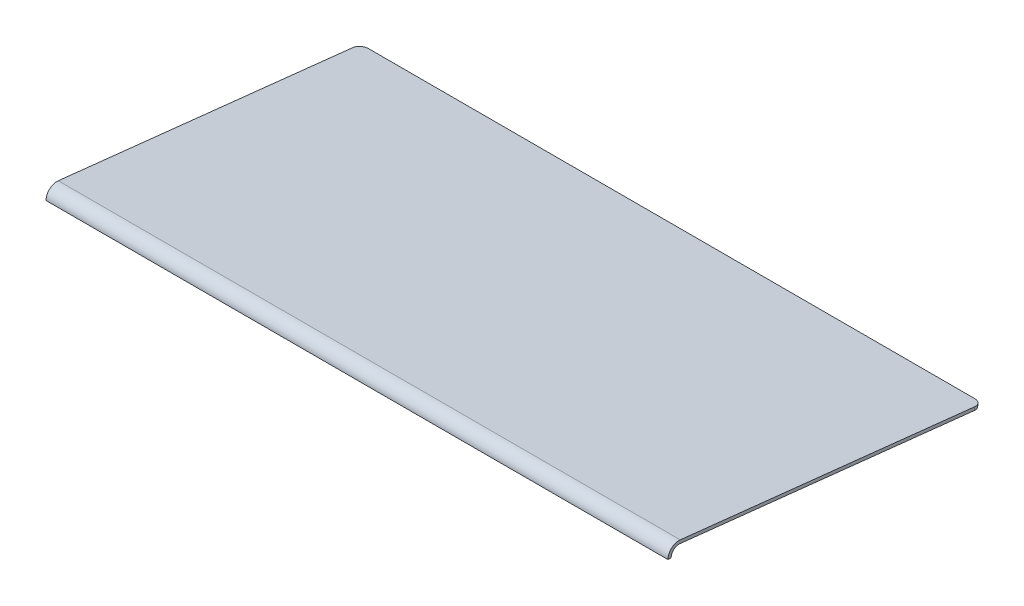
ISO-10303-21;
HEADER;
FILE_DESCRIPTION(('STEP AP214'),'2;1');
FILE_NAME('part.step','',(''),(''),'','','');
FILE_SCHEMA(('AUTOMOTIVE_DESIGN { 1 0 10303 214 1 1 1 1 }'));
ENDSEC;
DATA;
#1=APPLICATION_CONTEXT('core data for automotive mechanical design processes');
#2=APPLICATION_PROTOCOL_DEFINITION('international standard','automotive_design',2000,#1);
#3=PRODUCT_CONTEXT('',#1,'mechanical');
#4=PRODUCT('Part','Part','',(#3));
#5=PRODUCT_RELATED_PRODUCT_CATEGORY('part','',(#4));
#6=PRODUCT_DEFINITION_FORMATION('','',#4);
#7=PRODUCT_DEFINITION_CONTEXT('part definition',#1,'design');
#8=PRODUCT_DEFINITION('design','',#6,#7);
#9=PRODUCT_DEFINITION_SHAPE('','',#8);
#10=(LENGTH_UNIT() NAMED_UNIT(*) SI_UNIT(.MILLI.,.METRE.));
#11=(NAMED_UNIT(*) PLANE_ANGLE_UNIT() SI_UNIT($,.RADIAN.));
#12=(NAMED_UNIT(*) SI_UNIT($,.STERADIAN.) SOLID_ANGLE_UNIT());
#13=UNCERTAINTY_MEASURE_WITH_UNIT(LENGTH_MEASURE(1.E-05),#10,'distance_accuracy_value','');
#14=(GEOMETRIC_REPRESENTATION_CONTEXT(3) GLOBAL_UNCERTAINTY_ASSIGNED_CONTEXT((#13)) GLOBAL_UNIT_ASSIGNED_CONTEXT((#10,
#11,#12)) REPRESENTATION_CONTEXT('',''));
#15=CARTESIAN_POINT('',(0.,0.,0.));
#16=DIRECTION('',(0.,0.,1.));
#17=DIRECTION('',(1.,0.,0.));
#18=AXIS2_PLACEMENT_3D('',#15,#16,#17);
#19=CARTESIAN_POINT('',(362.,0.,0.));
#20=DIRECTION('',(1.,0.,0.));
#21=DIRECTION('',(0.,0.,-1.));
#22=AXIS2_PLACEMENT_3D('',#19,#20,#21);
#23=PLANE('',#22);
#24=DIRECTION('',(0.,0.,-1.));
#25=VECTOR('',#24,1.);
#26=CARTESIAN_POINT('',(362.,113.937005826671,37.4));
#27=LINE('',#26,#25);
#28=CARTESIAN_POINT('',(362.,113.937005826671,39.4));
#29=VERTEX_POINT('',#28);
#30=CARTESIAN_POINT('',(362.,113.937005826671,37.4));
#31=VERTEX_POINT('',#30);
#32=EDGE_CURVE('E56',#29,#31,#27,.T.);
#33=ORIENTED_EDGE('',*,*,#32,.T.);
#34=CARTESIAN_POINT('',(362.,113.937005826671,32.4));
#35=DIRECTION('',(1.,0.,0.));
#36=DIRECTION('',(0.,0.,-1.));
#37=AXIS2_PLACEMENT_3D('',#34,#35,#36);
#38=CIRCLE('',#37,5.00000000000001);
#39=CARTESIAN_POINT('',(362.,118.907830843486,31.8606497870554));
#40=VERTEX_POINT('',#39);
#41=EDGE_CURVE('E165',#40,#31,#38,.T.);
#42=ORIENTED_EDGE('',*,*,#41,.F.);
#43=DIRECTION('',(0.,0.107870042588919,0.994165003363056));
#44=VECTOR('',#43,1.);
#45=CARTESIAN_POINT('',(362.,100.,-142.4));
#46=LINE('',#45,#44);
#47=CARTESIAN_POINT('',(362.,98.6622549779722,-154.729088340045));
#48=VERTEX_POINT('',#47);
#49=EDGE_CURVE('E159',#48,#40,#46,.T.);
#50=ORIENTED_EDGE('',*,*,#49,.F.);
#51=DIRECTION('',(0.,-0.994165003363056,0.107870042588914));
#52=VECTOR('',#51,1.);
#53=CARTESIAN_POINT('',(362.,-15.4452148796673,-142.348067491777));
#54=LINE('',#53,#52);
#55=CARTESIAN_POINT('',(362.,100.650584984698,-154.944828425223));
#56=VERTEX_POINT('',#55);
#57=EDGE_CURVE('E151',#48,#56,#54,.F.);
#58=ORIENTED_EDGE('',*,*,#57,.T.);
#59=DIRECTION('',(0.,-0.107870042588919,-0.994165003363056));
#60=VECTOR('',#59,1.);
#61=CARTESIAN_POINT('',(362.,101.988330006726,-142.615740085178));
#62=LINE('',#61,#60);
#63=CARTESIAN_POINT('',(362.,120.896160850212,31.6449097018776));
#64=VERTEX_POINT('',#63);
#65=EDGE_CURVE('E120',#64,#56,#62,.T.);
#66=ORIENTED_EDGE('',*,*,#65,.F.);
#67=CARTESIAN_POINT('',(362.,113.937005826671,32.4));
#68=DIRECTION('',(1.,0.,0.));
#69=DIRECTION('',(0.,0.,-1.));
#70=AXIS2_PLACEMENT_3D('',#67,#68,#69);
#71=CIRCLE('',#70,7.00000000000001);
#72=EDGE_CURVE('E164',#29,#64,#71,.F.);
#73=ORIENTED_EDGE('',*,*,#72,.F.);
#74=EDGE_LOOP('',(#33,#42,#50,#58,#66,#73));
#75=FACE_BOUND('',#74,.T.);
#76=ADVANCED_FACE('F39',(#75),#23,.T.);
#77=CARTESIAN_POINT('',(-32.,113.937005826671,32.4));
#78=DIRECTION('',(-1.,0.,0.));
#79=DIRECTION('',(0.,0.,1.));
#80=AXIS2_PLACEMENT_3D('',#77,#78,#79);
#81=PLANE('',#80);
#82=DIRECTION('',(0.,0.,-1.));
#83=VECTOR('',#82,1.);
#84=CARTESIAN_POINT('',(-32.,113.937005826671,37.4));
#85=LINE('',#84,#83);
#86=CARTESIAN_POINT('',(-32.,113.937005826671,39.4));
#87=VERTEX_POINT('',#86);
#88=CARTESIAN_POINT('',(-32.,113.937005826671,37.4));
#89=VERTEX_POINT('',#88);
#90=EDGE_CURVE('E12',#87,#89,#85,.T.);
#91=ORIENTED_EDGE('',*,*,#90,.F.);
#92=CARTESIAN_POINT('',(-32.,113.937005826671,32.4));
#93=DIRECTION('',(-1.,0.,0.));
#94=DIRECTION('',(0.,0.,1.));
#95=AXIS2_PLACEMENT_3D('',#92,#93,#94);
#96=CIRCLE('',#95,7.00000000000001);
#97=CARTESIAN_POINT('',(-32.,120.896160850212,31.6449097018776));
#98=VERTEX_POINT('',#97);
#99=EDGE_CURVE('E154',#87,#98,#96,.T.);
#100=ORIENTED_EDGE('',*,*,#99,.T.);
#101=DIRECTION('',(0.,-0.107870042588919,-0.994165003363056));
#102=VECTOR('',#101,1.);
#103=CARTESIAN_POINT('',(-32.,101.988330006726,-142.615740085178));
#104=LINE('',#103,#102);
#105=CARTESIAN_POINT('',(-32.,100.650584984698,-154.944828425223));
#106=VERTEX_POINT('',#105);
#107=EDGE_CURVE('E150',#98,#106,#104,.T.);
#108=ORIENTED_EDGE('',*,*,#107,.T.);
#109=DIRECTION('',(0.,-0.994165003363056,0.107870042588914));
#110=VECTOR('',#109,1.);
#111=CARTESIAN_POINT('',(-32.,93.6914299611579,-154.1897381271));
#112=LINE('',#111,#110);
#113=CARTESIAN_POINT('',(-32.,98.6622549779722,-154.729088340045));
#114=VERTEX_POINT('',#113);
#115=EDGE_CURVE('E146',#106,#114,#112,.T.);
#116=ORIENTED_EDGE('',*,*,#115,.T.);
#117=DIRECTION('',(0.,0.107870042588919,0.994165003363056));
#118=VECTOR('',#117,1.);
#119=CARTESIAN_POINT('',(-32.,100.,-142.4));
#120=LINE('',#119,#118);
#121=CARTESIAN_POINT('',(-32.,118.907830843486,31.8606497870554));
#122=VERTEX_POINT('',#121);
#123=EDGE_CURVE('E149',#114,#122,#120,.T.);
#124=ORIENTED_EDGE('',*,*,#123,.T.);
#125=CARTESIAN_POINT('',(-32.,113.937005826671,32.4));
#126=DIRECTION('',(1.,0.,0.));
#127=DIRECTION('',(0.,0.,1.));
#128=AXIS2_PLACEMENT_3D('',#125,#126,#127);
#129=CIRCLE('',#128,5.00000000000001);
#130=EDGE_CURVE('E181',#122,#89,#129,.T.);
#131=ORIENTED_EDGE('',*,*,#130,.T.);
#132=EDGE_LOOP('',(#91,#100,#108,#116,#124,#131));
#133=FACE_BOUND('',#132,.T.);
#134=ADVANCED_FACE('F207',(#133),#81,.T.);
#135=CARTESIAN_POINT('',(853.368633251326,113.937005826671,32.4));
#136=DIRECTION('',(-1.,0.,0.));
#137=DIRECTION('',(0.,0.,1.));
#138=AXIS2_PLACEMENT_3D('',#135,#136,#137);
#139=CYLINDRICAL_SURFACE('',#138,5.00000000000001);
#140=DIRECTION('',(-1.,0.,0.));
#141=VECTOR('',#140,1.);
#142=CARTESIAN_POINT('',(853.368633251326,118.907830843486,31.8606497870554));
#143=LINE('',#142,#141);
#144=EDGE_CURVE('E155',#40,#122,#143,.T.);
#145=ORIENTED_EDGE('',*,*,#144,.F.);
#146=ORIENTED_EDGE('',*,*,#41,.T.);
#147=DIRECTION('',(-1.,0.,0.));
#148=VECTOR('',#147,1.);
#149=CARTESIAN_POINT('',(853.368633251326,113.937005826671,37.4));
#150=LINE('',#149,#148);
#151=EDGE_CURVE('E160',#31,#89,#150,.T.);
#152=ORIENTED_EDGE('',*,*,#151,.T.);
#153=ORIENTED_EDGE('',*,*,#130,.F.);
#154=EDGE_LOOP('',(#145,#146,#152,#153));
#155=FACE_BOUND('',#154,.T.);
#156=ADVANCED_FACE('F198',(#155),#139,.F.);
#157=CARTESIAN_POINT('',(853.368633251326,113.937005826671,32.4));
#158=DIRECTION('',(-1.,0.,0.));
#159=DIRECTION('',(0.,0.,1.));
#160=AXIS2_PLACEMENT_3D('',#157,#158,#159);
#161=CYLINDRICAL_SURFACE('',#160,7.00000000000001);
#162=DIRECTION('',(-1.,0.,0.));
#163=VECTOR('',#162,1.);
#164=CARTESIAN_POINT('',(853.368633251326,113.937005826671,39.4));
#165=LINE('',#164,#163);
#166=EDGE_CURVE('E48',#29,#87,#165,.T.);
#167=ORIENTED_EDGE('',*,*,#166,.F.);
#168=ORIENTED_EDGE('',*,*,#72,.T.);
#169=DIRECTION('',(-1.,0.,0.));
#170=VECTOR('',#169,1.);
#171=CARTESIAN_POINT('',(853.368633251326,120.896160850212,31.6449097018776));
#172=LINE('',#171,#170);
#173=EDGE_CURVE('E168',#64,#98,#172,.T.);
#174=ORIENTED_EDGE('',*,*,#173,.T.);
#175=ORIENTED_EDGE('',*,*,#99,.F.);
#176=EDGE_LOOP('',(#167,#168,#174,#175));
#177=FACE_BOUND('',#176,.T.);
#178=ADVANCED_FACE('F205',(#177),#161,.T.);
#179=CARTESIAN_POINT('',(853.368633251326,101.988330006726,-142.615740085178));
#180=DIRECTION('',(0.,0.994165003363056,-0.107870042588919));
#181=DIRECTION('',(0.,0.107870042588919,0.994165003363056));
#182=AXIS2_PLACEMENT_3D('',#179,#180,#181);
#183=PLANE('',#182);
#184=ORIENTED_EDGE('',*,*,#65,.T.);
#185=CARTESIAN_POINT('',(357.,100.650584984698,-154.944828425223));
#186=DIRECTION('',(0.,0.994165003363056,-0.107870042588919));
#187=DIRECTION('',(0.,0.107870042588919,0.994165003363056));
#188=AXIS2_PLACEMENT_3D('',#185,#186,#187);
#189=CIRCLE('',#188,5.);
#190=CARTESIAN_POINT('',(357.,100.111234771754,-159.915653442038));
#191=VERTEX_POINT('',#190);
#192=EDGE_CURVE('E115',#56,#191,#189,.T.);
#193=ORIENTED_EDGE('',*,*,#192,.T.);
#194=DIRECTION('',(-1.,0.,0.));
#195=VECTOR('',#194,1.);
#196=CARTESIAN_POINT('',(853.368633251326,100.111234771754,-159.915653442038));
#197=LINE('',#196,#195);
#198=CARTESIAN_POINT('',(-26.9999999999998,100.111234771754,-159.915653442038));
#199=VERTEX_POINT('',#198);
#200=EDGE_CURVE('E117',#191,#199,#197,.T.);
#201=ORIENTED_EDGE('',*,*,#200,.T.);
#202=CARTESIAN_POINT('',(-27.,100.650584984698,-154.944828425223));
#203=DIRECTION('',(0.,0.994165003363056,-0.107870042588919));
#204=DIRECTION('',(0.,0.107870042588919,0.994165003363056));
#205=AXIS2_PLACEMENT_3D('',#202,#203,#204);
#206=CIRCLE('',#205,5.);
#207=EDGE_CURVE('E130',#199,#106,#206,.T.);
#208=ORIENTED_EDGE('',*,*,#207,.T.);
#209=ORIENTED_EDGE('',*,*,#107,.F.);
#210=ORIENTED_EDGE('',*,*,#173,.F.);
#211=EDGE_LOOP('',(#184,#193,#201,#208,#209,#210));
#212=FACE_BOUND('',#211,.T.);
#213=ADVANCED_FACE('F116',(#212),#183,.T.);
#214=CARTESIAN_POINT('',(853.368633251326,100.111234771754,-159.915653442038));
#215=DIRECTION('',(0.,-0.107870042588914,-0.994165003363056));
#216=DIRECTION('',(0.,0.994165003363056,-0.107870042588914));
#217=AXIS2_PLACEMENT_3D('',#214,#215,#216);
#218=PLANE('',#217);
#219=ORIENTED_EDGE('',*,*,#200,.F.);
#220=DIRECTION('',(0.,-0.994165003363056,0.107870042588914));
#221=VECTOR('',#220,1.);
#222=CARTESIAN_POINT('',(357.,100.111234771754,-159.915653442038));
#223=LINE('',#222,#221);
#224=CARTESIAN_POINT('',(357.,98.1229047650276,-159.69991335686));
#225=VERTEX_POINT('',#224);
#226=EDGE_CURVE('E128',#191,#225,#223,.T.);
#227=ORIENTED_EDGE('',*,*,#226,.T.);
#228=DIRECTION('',(-1.,0.,0.));
#229=VECTOR('',#228,1.);
#230=CARTESIAN_POINT('',(853.368633251326,98.1229047650276,-159.69991335686));
#231=LINE('',#230,#229);
#232=CARTESIAN_POINT('',(-26.9999999999998,98.1229047650276,-159.69991335686));
#233=VERTEX_POINT('',#232);
#234=EDGE_CURVE('E134',#225,#233,#231,.T.);
#235=ORIENTED_EDGE('',*,*,#234,.T.);
#236=DIRECTION('',(0.,-0.994165003363056,0.107870042588914));
#237=VECTOR('',#236,1.);
#238=CARTESIAN_POINT('',(-27.,100.111234771754,-159.915653442038));
#239=LINE('',#238,#237);
#240=EDGE_CURVE('E107',#233,#199,#239,.F.);
#241=ORIENTED_EDGE('',*,*,#240,.T.);
#242=EDGE_LOOP('',(#219,#227,#235,#241));
#243=FACE_BOUND('',#242,.T.);
#244=ADVANCED_FACE('F127',(#243),#218,.T.);
#245=CARTESIAN_POINT('',(853.368633251326,100.,-142.4));
#246=DIRECTION('',(0.,-0.994165003363056,0.107870042588919));
#247=DIRECTION('',(0.,-0.107870042588919,-0.994165003363056));
#248=AXIS2_PLACEMENT_3D('',#245,#246,#247);
#249=PLANE('',#248);
#250=ORIENTED_EDGE('',*,*,#234,.F.);
#251=CARTESIAN_POINT('',(357.,98.6622549779722,-154.729088340045));
#252=DIRECTION('',(0.,-0.994165003363056,0.107870042588919));
#253=DIRECTION('',(0.,-0.107870042588919,-0.994165003363056));
#254=AXIS2_PLACEMENT_3D('',#251,#252,#253);
#255=CIRCLE('',#254,5.);
#256=EDGE_CURVE('E100',#225,#48,#255,.T.);
#257=ORIENTED_EDGE('',*,*,#256,.T.);
#258=ORIENTED_EDGE('',*,*,#49,.T.);
#259=ORIENTED_EDGE('',*,*,#144,.T.);
#260=ORIENTED_EDGE('',*,*,#123,.F.);
#261=CARTESIAN_POINT('',(-27.,98.6622549779722,-154.729088340045));
#262=DIRECTION('',(0.,-0.994165003363056,0.107870042588919));
#263=DIRECTION('',(0.,-0.107870042588919,-0.994165003363056));
#264=AXIS2_PLACEMENT_3D('',#261,#262,#263);
#265=CIRCLE('',#264,5.);
#266=EDGE_CURVE('E84',#114,#233,#265,.T.);
#267=ORIENTED_EDGE('',*,*,#266,.T.);
#268=EDGE_LOOP('',(#250,#257,#258,#259,#260,#267));
#269=FACE_BOUND('',#268,.T.);
#270=ADVANCED_FACE('F201',(#269),#249,.T.);
#271=CARTESIAN_POINT('',(357.,100.650584984698,-154.944828425223));
#272=DIRECTION('',(0.,-0.994165003363056,0.107870042588914));
#273=DIRECTION('',(0.,-0.107870042588914,-0.994165003363056));
#274=AXIS2_PLACEMENT_3D('',#271,#272,#273);
#275=CYLINDRICAL_SURFACE('',#274,5.);
#276=ORIENTED_EDGE('',*,*,#192,.F.);
#277=ORIENTED_EDGE('',*,*,#57,.F.);
#278=ORIENTED_EDGE('',*,*,#256,.F.);
#279=ORIENTED_EDGE('',*,*,#226,.F.);
#280=EDGE_LOOP('',(#276,#277,#278,#279));
#281=FACE_BOUND('',#280,.T.);
#282=ADVANCED_FACE('F132',(#281),#275,.T.);
#283=CARTESIAN_POINT('',(-27.,93.6914299611579,-154.1897381271));
#284=DIRECTION('',(0.,-0.994165003363056,0.107870042588914));
#285=DIRECTION('',(0.,-0.107870042588914,-0.994165003363056));
#286=AXIS2_PLACEMENT_3D('',#283,#284,#285);
#287=CYLINDRICAL_SURFACE('',#286,5.);
#288=ORIENTED_EDGE('',*,*,#207,.F.);
#289=ORIENTED_EDGE('',*,*,#240,.F.);
#290=ORIENTED_EDGE('',*,*,#266,.F.);
#291=ORIENTED_EDGE('',*,*,#115,.F.);
#292=EDGE_LOOP('',(#288,#289,#290,#291));
#293=FACE_BOUND('',#292,.T.);
#294=ADVANCED_FACE('F210',(#293),#287,.T.);
#295=CARTESIAN_POINT('',(364.061552812809,113.937005826671,37.4));
#296=DIRECTION('',(0.,1.,0.));
#297=DIRECTION('',(0.,0.,1.));
#298=AXIS2_PLACEMENT_3D('',#295,#296,#297);
#299=PLANE('',#298);
#300=ORIENTED_EDGE('',*,*,#166,.T.);
#301=ORIENTED_EDGE('',*,*,#90,.T.);
#302=ORIENTED_EDGE('',*,*,#151,.F.);
#303=ORIENTED_EDGE('',*,*,#32,.F.);
#304=EDGE_LOOP('',(#300,#301,#302,#303));
#305=FACE_BOUND('',#304,.T.);
#306=ADVANCED_FACE('F208',(#305),#299,.F.);
#307=CLOSED_SHELL('',(#76,#134,#156,#178,#213,#244,#270,#282,#294,#306));
#308=MANIFOLD_SOLID_BREP('B2',#307);
#309=ADVANCED_BREP_SHAPE_REPRESENTATION('',(#18,#308),#14);
#310=SHAPE_DEFINITION_REPRESENTATION(#9,#309);
ENDSEC;
END-ISO-10303-21;
